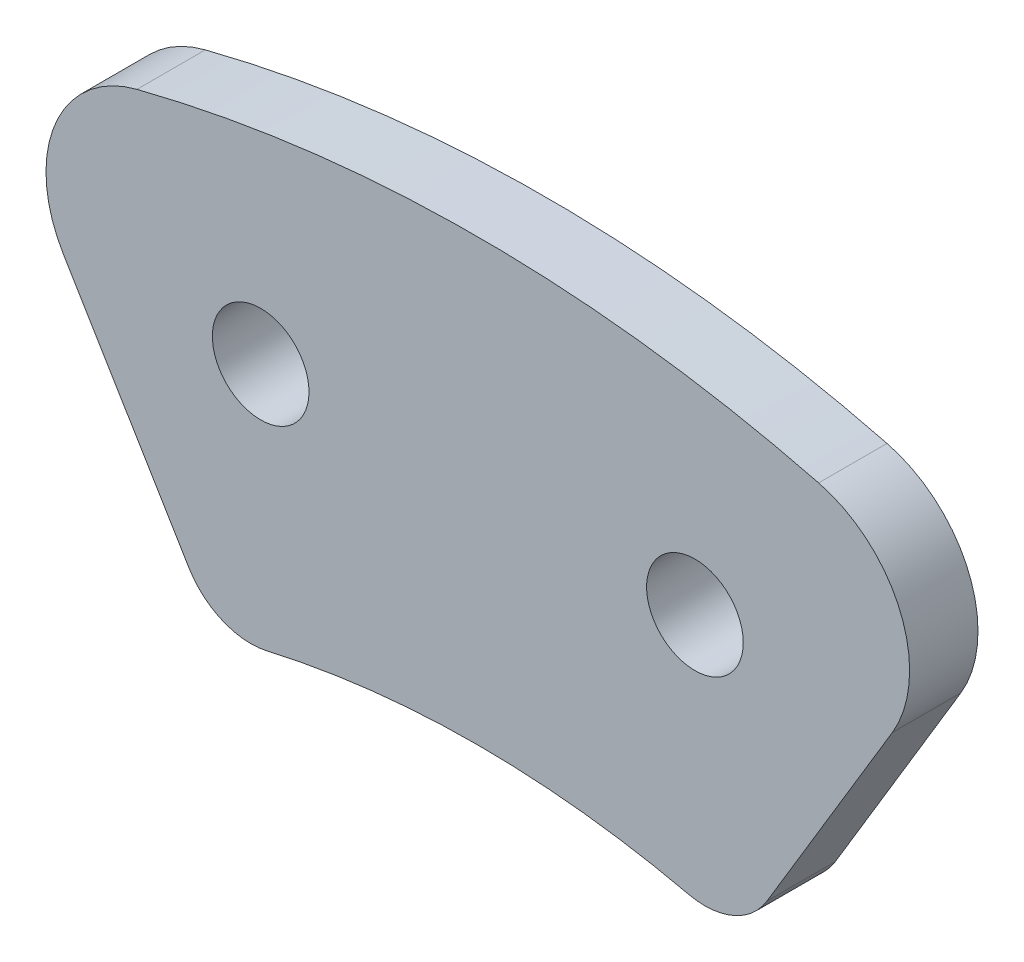
ISO-10303-21;
HEADER;
FILE_DESCRIPTION(('STEP AP214'),'2;1');
FILE_NAME('part.step','',(''),(''),'','','');
FILE_SCHEMA(('AUTOMOTIVE_DESIGN { 1 0 10303 214 1 1 1 1 }'));
ENDSEC;
DATA;
#1=APPLICATION_CONTEXT('core data for automotive mechanical design processes');
#2=APPLICATION_PROTOCOL_DEFINITION('international standard','automotive_design',2000,#1);
#3=PRODUCT_CONTEXT('',#1,'mechanical');
#4=PRODUCT('Part','Part','',(#3));
#5=PRODUCT_RELATED_PRODUCT_CATEGORY('part','',(#4));
#6=PRODUCT_DEFINITION_FORMATION('','',#4);
#7=PRODUCT_DEFINITION_CONTEXT('part definition',#1,'design');
#8=PRODUCT_DEFINITION('design','',#6,#7);
#9=PRODUCT_DEFINITION_SHAPE('','',#8);
#10=(LENGTH_UNIT() NAMED_UNIT(*) SI_UNIT(.MILLI.,.METRE.));
#11=(NAMED_UNIT(*) PLANE_ANGLE_UNIT() SI_UNIT($,.RADIAN.));
#12=(NAMED_UNIT(*) SI_UNIT($,.STERADIAN.) SOLID_ANGLE_UNIT());
#13=UNCERTAINTY_MEASURE_WITH_UNIT(LENGTH_MEASURE(1.E-05),#10,'distance_accuracy_value','');
#14=(GEOMETRIC_REPRESENTATION_CONTEXT(3) GLOBAL_UNCERTAINTY_ASSIGNED_CONTEXT((#13)) GLOBAL_UNIT_ASSIGNED_CONTEXT((#10,
#11,#12)) REPRESENTATION_CONTEXT('',''));
#15=CARTESIAN_POINT('',(0.,0.,0.));
#16=DIRECTION('',(0.,0.,1.));
#17=DIRECTION('',(1.,0.,0.));
#18=AXIS2_PLACEMENT_3D('',#15,#16,#17);
#19=CARTESIAN_POINT('',(0.,0.,0.75));
#20=DIRECTION('',(0.,0.,1.));
#21=DIRECTION('',(1.,0.,0.));
#22=AXIS2_PLACEMENT_3D('',#19,#20,#21);
#23=PLANE('',#22);
#24=CARTESIAN_POINT('',(-4.76250000000001,25.4771247449903,0.75));
#25=DIRECTION('',(0.,0.,1.));
#26=DIRECTION('',(1.,0.,0.));
#27=AXIS2_PLACEMENT_3D('',#24,#25,#26);
#28=CIRCLE('',#27,1.06);
#29=CARTESIAN_POINT('',(-3.70250000000001,25.4771247449903,0.75));
#30=VERTEX_POINT('',#29);
#31=EDGE_CURVE('E176',#30,#30,#28,.T.);
#32=ORIENTED_EDGE('',*,*,#31,.F.);
#33=EDGE_LOOP('',(#32));
#34=FACE_BOUND('',#33,.T.);
#35=DIRECTION('',(0.515038074910055,-0.857167300702112,0.));
#36=VECTOR('',#35,1.);
#37=CARTESIAN_POINT('',(-5.73072103720139,19.8109311438067,0.75));
#38=LINE('',#37,#36);
#39=CARTESIAN_POINT('',(-9.09308728234167,25.4068482977416,0.75));
#40=VERTEX_POINT('',#39);
#41=CARTESIAN_POINT('',(-6.34238958738464,20.8289185618757,0.75));
#42=VERTEX_POINT('',#41);
#43=EDGE_CURVE('E135',#40,#42,#38,.T.);
#44=ORIENTED_EDGE('',*,*,#43,.T.);
#45=CARTESIAN_POINT('',(-4.97949357926829,21.6478291009827,0.75));
#46=DIRECTION('',(0.,0.,1.));
#47=DIRECTION('',(1.,0.,0.));
#48=AXIS2_PLACEMENT_3D('',#45,#46,#47);
#49=CIRCLE('',#48,1.59);
#50=CARTESIAN_POINT('',(-4.62306523976564,20.0982940614307,0.75));
#51=VERTEX_POINT('',#50);
#52=EDGE_CURVE('E39',#42,#51,#49,.T.);
#53=ORIENTED_EDGE('',*,*,#52,.T.);
#54=CARTESIAN_POINT('',(0.,0.,0.75));
#55=DIRECTION('',(0.,0.,-1.));
#56=DIRECTION('',(1.,0.,0.));
#57=AXIS2_PLACEMENT_3D('',#54,#55,#56);
#58=CIRCLE('',#57,20.6231461322193);
#59=CARTESIAN_POINT('',(4.62306523976564,20.0982940614307,0.75));
#60=VERTEX_POINT('',#59);
#61=EDGE_CURVE('E129',#51,#60,#58,.T.);
#62=ORIENTED_EDGE('',*,*,#61,.T.);
#63=CARTESIAN_POINT('',(4.97949357926829,21.6478291009827,0.75));
#64=DIRECTION('',(0.,0.,1.));
#65=DIRECTION('',(1.,0.,0.));
#66=AXIS2_PLACEMENT_3D('',#63,#64,#65);
#67=CIRCLE('',#66,1.59);
#68=CARTESIAN_POINT('',(6.34238958738464,20.8289185618757,0.75));
#69=VERTEX_POINT('',#68);
#70=EDGE_CURVE('E46',#60,#69,#67,.T.);
#71=ORIENTED_EDGE('',*,*,#70,.T.);
#72=DIRECTION('',(0.515038074910056,0.857167300702111,0.));
#73=VECTOR('',#72,1.);
#74=CARTESIAN_POINT('',(5.73072103720139,19.8109311438067,0.75));
#75=LINE('',#74,#73);
#76=CARTESIAN_POINT('',(9.09308728234167,25.4068482977416,0.75));
#77=VERTEX_POINT('',#76);
#78=EDGE_CURVE('E165',#69,#77,#75,.T.);
#79=ORIENTED_EDGE('',*,*,#78,.T.);
#80=CARTESIAN_POINT('',(6.82159393548107,26.7716991962532,0.75));
#81=DIRECTION('',(0.,0.,1.));
#82=DIRECTION('',(1.,0.,0.));
#83=AXIS2_PLACEMENT_3D('',#80,#81,#82);
#84=CIRCLE('',#83,2.65);
#85=CARTESIAN_POINT('',(7.47592275528715,29.3396465858177,0.75));
#86=VERTEX_POINT('',#85);
#87=EDGE_CURVE('E141',#77,#86,#84,.T.);
#88=ORIENTED_EDGE('',*,*,#87,.T.);
#89=CARTESIAN_POINT('',(0.,0.,0.75));
#90=DIRECTION('',(0.,0.,1.));
#91=DIRECTION('',(1.,0.,0.));
#92=AXIS2_PLACEMENT_3D('',#89,#90,#91);
#93=CIRCLE('',#92,30.2771247449903);
#94=CARTESIAN_POINT('',(-7.47592275528715,29.3396465858177,0.75));
#95=VERTEX_POINT('',#94);
#96=EDGE_CURVE('E119',#86,#95,#93,.T.);
#97=ORIENTED_EDGE('',*,*,#96,.T.);
#98=CARTESIAN_POINT('',(-6.82159393548107,26.7716991962532,0.75));
#99=DIRECTION('',(0.,0.,1.));
#100=DIRECTION('',(1.,0.,0.));
#101=AXIS2_PLACEMENT_3D('',#98,#99,#100);
#102=CIRCLE('',#101,2.65);
#103=EDGE_CURVE('E139',#95,#40,#102,.T.);
#104=ORIENTED_EDGE('',*,*,#103,.T.);
#105=EDGE_LOOP('',(#44,#53,#62,#71,#79,#88,#97,#104));
#106=FACE_BOUND('',#105,.T.);
#107=CARTESIAN_POINT('',(4.76250000000001,25.4771247449903,0.75));
#108=DIRECTION('',(0.,0.,1.));
#109=DIRECTION('',(1.,0.,0.));
#110=AXIS2_PLACEMENT_3D('',#107,#108,#109);
#111=CIRCLE('',#110,1.06);
#112=CARTESIAN_POINT('',(5.82250000000001,25.4771247449903,0.75));
#113=VERTEX_POINT('',#112);
#114=EDGE_CURVE('E183',#113,#113,#111,.T.);
#115=ORIENTED_EDGE('',*,*,#114,.F.);
#116=EDGE_LOOP('',(#115));
#117=FACE_BOUND('',#116,.T.);
#118=ADVANCED_FACE('F31',(#34,#106,#117),#23,.T.);
#119=CARTESIAN_POINT('',(0.,0.,-0.75));
#120=DIRECTION('',(0.,0.,1.));
#121=DIRECTION('',(1.,0.,0.));
#122=AXIS2_PLACEMENT_3D('',#119,#120,#121);
#123=PLANE('',#122);
#124=CARTESIAN_POINT('',(-4.76250000000001,25.4771247449903,-0.75));
#125=DIRECTION('',(0.,0.,1.));
#126=DIRECTION('',(1.,0.,0.));
#127=AXIS2_PLACEMENT_3D('',#124,#125,#126);
#128=CIRCLE('',#127,1.06);
#129=CARTESIAN_POINT('',(-3.70250000000001,25.4771247449903,-0.75));
#130=VERTEX_POINT('',#129);
#131=EDGE_CURVE('E178',#130,#130,#128,.T.);
#132=ORIENTED_EDGE('',*,*,#131,.T.);
#133=EDGE_LOOP('',(#132));
#134=FACE_BOUND('',#133,.T.);
#135=CARTESIAN_POINT('',(0.,0.,-0.75));
#136=DIRECTION('',(0.,0.,-1.));
#137=DIRECTION('',(1.,0.,0.));
#138=AXIS2_PLACEMENT_3D('',#135,#136,#137);
#139=CIRCLE('',#138,20.6231461322193);
#140=CARTESIAN_POINT('',(-4.62306523976564,20.0982940614307,-0.75));
#141=VERTEX_POINT('',#140);
#142=CARTESIAN_POINT('',(4.62306523976564,20.0982940614307,-0.75));
#143=VERTEX_POINT('',#142);
#144=EDGE_CURVE('E131',#141,#143,#139,.T.);
#145=ORIENTED_EDGE('',*,*,#144,.F.);
#146=CARTESIAN_POINT('',(-4.97949357926829,21.6478291009827,-0.75));
#147=DIRECTION('',(0.,0.,1.));
#148=DIRECTION('',(1.,0.,0.));
#149=AXIS2_PLACEMENT_3D('',#146,#147,#148);
#150=CIRCLE('',#149,1.59);
#151=CARTESIAN_POINT('',(-6.34238958738464,20.8289185618757,-0.75));
#152=VERTEX_POINT('',#151);
#153=EDGE_CURVE('E153',#141,#152,#150,.F.);
#154=ORIENTED_EDGE('',*,*,#153,.T.);
#155=DIRECTION('',(0.515038074910055,-0.857167300702112,0.));
#156=VECTOR('',#155,1.);
#157=CARTESIAN_POINT('',(-5.73072103720139,19.8109311438067,-0.75));
#158=LINE('',#157,#156);
#159=CARTESIAN_POINT('',(-9.09308728234167,25.4068482977416,-0.75));
#160=VERTEX_POINT('',#159);
#161=EDGE_CURVE('E126',#160,#152,#158,.T.);
#162=ORIENTED_EDGE('',*,*,#161,.F.);
#163=CARTESIAN_POINT('',(-6.82159393548107,26.7716991962532,-0.75));
#164=DIRECTION('',(0.,0.,1.));
#165=DIRECTION('',(1.,0.,0.));
#166=AXIS2_PLACEMENT_3D('',#163,#164,#165);
#167=CIRCLE('',#166,2.65);
#168=CARTESIAN_POINT('',(-7.47592275528715,29.3396465858177,-0.75));
#169=VERTEX_POINT('',#168);
#170=EDGE_CURVE('E110',#160,#169,#167,.F.);
#171=ORIENTED_EDGE('',*,*,#170,.T.);
#172=CARTESIAN_POINT('',(0.,0.,-0.75));
#173=DIRECTION('',(0.,0.,1.));
#174=DIRECTION('',(1.,0.,0.));
#175=AXIS2_PLACEMENT_3D('',#172,#173,#174);
#176=CIRCLE('',#175,30.2771247449903);
#177=CARTESIAN_POINT('',(7.47592275528715,29.3396465858177,-0.75));
#178=VERTEX_POINT('',#177);
#179=EDGE_CURVE('E116',#178,#169,#176,.T.);
#180=ORIENTED_EDGE('',*,*,#179,.F.);
#181=CARTESIAN_POINT('',(6.82159393548107,26.7716991962532,-0.75));
#182=DIRECTION('',(0.,0.,1.));
#183=DIRECTION('',(1.,0.,0.));
#184=AXIS2_PLACEMENT_3D('',#181,#182,#183);
#185=CIRCLE('',#184,2.65);
#186=CARTESIAN_POINT('',(9.09308728234167,25.4068482977416,-0.75));
#187=VERTEX_POINT('',#186);
#188=EDGE_CURVE('E100',#178,#187,#185,.F.);
#189=ORIENTED_EDGE('',*,*,#188,.T.);
#190=DIRECTION('',(0.515038074910055,0.857167300702112,0.));
#191=VECTOR('',#190,1.);
#192=CARTESIAN_POINT('',(8.3001417413429,24.087165303236,-0.75));
#193=LINE('',#192,#191);
#194=CARTESIAN_POINT('',(6.34238958738465,20.8289185618757,-0.75));
#195=VERTEX_POINT('',#194);
#196=EDGE_CURVE('E127',#195,#187,#193,.T.);
#197=ORIENTED_EDGE('',*,*,#196,.F.);
#198=CARTESIAN_POINT('',(4.97949357926829,21.6478291009827,-0.75));
#199=DIRECTION('',(0.,0.,1.));
#200=DIRECTION('',(1.,0.,0.));
#201=AXIS2_PLACEMENT_3D('',#198,#199,#200);
#202=CIRCLE('',#201,1.59);
#203=EDGE_CURVE('E151',#195,#143,#202,.F.);
#204=ORIENTED_EDGE('',*,*,#203,.T.);
#205=EDGE_LOOP('',(#145,#154,#162,#171,#180,#189,#197,#204));
#206=FACE_BOUND('',#205,.T.);
#207=CARTESIAN_POINT('',(4.76250000000001,25.4771247449903,-0.75));
#208=DIRECTION('',(0.,0.,1.));
#209=DIRECTION('',(1.,0.,0.));
#210=AXIS2_PLACEMENT_3D('',#207,#208,#209);
#211=CIRCLE('',#210,1.06);
#212=CARTESIAN_POINT('',(5.82250000000001,25.4771247449903,-0.75));
#213=VERTEX_POINT('',#212);
#214=EDGE_CURVE('E186',#213,#213,#211,.T.);
#215=ORIENTED_EDGE('',*,*,#214,.T.);
#216=EDGE_LOOP('',(#215));
#217=FACE_BOUND('',#216,.T.);
#218=ADVANCED_FACE('F123',(#134,#206,#217),#123,.F.);
#219=CARTESIAN_POINT('',(0.,0.,0.75));
#220=DIRECTION('',(0.,0.,-1.));
#221=DIRECTION('',(-1.,0.,0.));
#222=AXIS2_PLACEMENT_3D('',#219,#220,#221);
#223=CYLINDRICAL_SURFACE('',#222,20.6231461322193);
#224=ORIENTED_EDGE('',*,*,#61,.F.);
#225=DIRECTION('',(0.,0.,-1.));
#226=VECTOR('',#225,1.);
#227=CARTESIAN_POINT('',(-4.62306523976564,20.0982940614307,0.75));
#228=LINE('',#227,#226);
#229=EDGE_CURVE('E148',#51,#141,#228,.T.);
#230=ORIENTED_EDGE('',*,*,#229,.T.);
#231=ORIENTED_EDGE('',*,*,#144,.T.);
#232=DIRECTION('',(0.,0.,-1.));
#233=VECTOR('',#232,1.);
#234=CARTESIAN_POINT('',(4.62306523976564,20.0982940614307,0.75));
#235=LINE('',#234,#233);
#236=EDGE_CURVE('E146',#143,#60,#235,.F.);
#237=ORIENTED_EDGE('',*,*,#236,.T.);
#238=EDGE_LOOP('',(#224,#230,#231,#237));
#239=FACE_BOUND('',#238,.T.);
#240=ADVANCED_FACE('F162',(#239),#223,.F.);
#241=CARTESIAN_POINT('',(8.3001417413429,24.087165303236,0.75));
#242=DIRECTION('',(-0.857167300702112,0.515038074910055,0.));
#243=DIRECTION('',(-0.515038074910055,-0.857167300702112,0.));
#244=AXIS2_PLACEMENT_3D('',#241,#242,#243);
#245=PLANE('',#244);
#246=ORIENTED_EDGE('',*,*,#78,.F.);
#247=DIRECTION('',(0.,0.,-1.));
#248=VECTOR('',#247,1.);
#249=CARTESIAN_POINT('',(6.34238958738465,20.8289185618757,0.75));
#250=LINE('',#249,#248);
#251=EDGE_CURVE('E11',#69,#195,#250,.T.);
#252=ORIENTED_EDGE('',*,*,#251,.T.);
#253=ORIENTED_EDGE('',*,*,#196,.T.);
#254=DIRECTION('',(0.,0.,-1.));
#255=VECTOR('',#254,1.);
#256=CARTESIAN_POINT('',(9.09308728234167,25.4068482977416,0.75));
#257=LINE('',#256,#255);
#258=EDGE_CURVE('E106',#187,#77,#257,.F.);
#259=ORIENTED_EDGE('',*,*,#258,.T.);
#260=EDGE_LOOP('',(#246,#252,#253,#259));
#261=FACE_BOUND('',#260,.T.);
#262=ADVANCED_FACE('F210',(#261),#245,.F.);
#263=CARTESIAN_POINT('',(0.,0.,0.75));
#264=DIRECTION('',(0.,0.,-1.));
#265=DIRECTION('',(-1.,0.,0.));
#266=AXIS2_PLACEMENT_3D('',#263,#264,#265);
#267=CYLINDRICAL_SURFACE('',#266,30.2771247449903);
#268=ORIENTED_EDGE('',*,*,#96,.F.);
#269=DIRECTION('',(0.,0.,-1.));
#270=VECTOR('',#269,1.);
#271=CARTESIAN_POINT('',(7.47592275528715,29.3396465858177,0.75));
#272=LINE('',#271,#270);
#273=EDGE_CURVE('E104',#86,#178,#272,.T.);
#274=ORIENTED_EDGE('',*,*,#273,.T.);
#275=ORIENTED_EDGE('',*,*,#179,.T.);
#276=DIRECTION('',(0.,0.,-1.));
#277=VECTOR('',#276,1.);
#278=CARTESIAN_POINT('',(-7.47592275528715,29.3396465858177,0.75));
#279=LINE('',#278,#277);
#280=EDGE_CURVE('E120',#169,#95,#279,.F.);
#281=ORIENTED_EDGE('',*,*,#280,.T.);
#282=EDGE_LOOP('',(#268,#274,#275,#281));
#283=FACE_BOUND('',#282,.T.);
#284=ADVANCED_FACE('F115',(#283),#267,.T.);
#285=CARTESIAN_POINT('',(-5.73072103720139,19.8109311438067,0.75));
#286=DIRECTION('',(0.857167300702111,0.515038074910055,0.));
#287=DIRECTION('',(-0.515038074910055,0.857167300702112,0.));
#288=AXIS2_PLACEMENT_3D('',#285,#286,#287);
#289=PLANE('',#288);
#290=ORIENTED_EDGE('',*,*,#161,.T.);
#291=DIRECTION('',(0.,0.,-1.));
#292=VECTOR('',#291,1.);
#293=CARTESIAN_POINT('',(-6.34238958738464,20.8289185618757,0.75));
#294=LINE('',#293,#292);
#295=EDGE_CURVE('E54',#152,#42,#294,.F.);
#296=ORIENTED_EDGE('',*,*,#295,.T.);
#297=ORIENTED_EDGE('',*,*,#43,.F.);
#298=DIRECTION('',(0.,0.,-1.));
#299=VECTOR('',#298,1.);
#300=CARTESIAN_POINT('',(-9.09308728234167,25.4068482977416,0.75));
#301=LINE('',#300,#299);
#302=EDGE_CURVE('E143',#40,#160,#301,.T.);
#303=ORIENTED_EDGE('',*,*,#302,.T.);
#304=EDGE_LOOP('',(#290,#296,#297,#303));
#305=FACE_BOUND('',#304,.T.);
#306=ADVANCED_FACE('F168',(#305),#289,.F.);
#307=CARTESIAN_POINT('',(-4.76250000000001,25.4771247449903,0.75));
#308=DIRECTION('',(0.,0.,-1.));
#309=DIRECTION('',(-1.,0.,0.));
#310=AXIS2_PLACEMENT_3D('',#307,#308,#309);
#311=CYLINDRICAL_SURFACE('',#310,1.06);
#312=ORIENTED_EDGE('',*,*,#31,.T.);
#313=EDGE_LOOP('',(#312));
#314=FACE_BOUND('',#313,.T.);
#315=ORIENTED_EDGE('',*,*,#131,.F.);
#316=EDGE_LOOP('',(#315));
#317=FACE_BOUND('',#316,.T.);
#318=ADVANCED_FACE('F203',(#314,#317),#311,.F.);
#319=CARTESIAN_POINT('',(4.76250000000001,25.4771247449903,0.75));
#320=DIRECTION('',(0.,0.,-1.));
#321=DIRECTION('',(-1.,0.,0.));
#322=AXIS2_PLACEMENT_3D('',#319,#320,#321);
#323=CYLINDRICAL_SURFACE('',#322,1.06);
#324=ORIENTED_EDGE('',*,*,#114,.T.);
#325=EDGE_LOOP('',(#324));
#326=FACE_BOUND('',#325,.T.);
#327=ORIENTED_EDGE('',*,*,#214,.F.);
#328=EDGE_LOOP('',(#327));
#329=FACE_BOUND('',#328,.T.);
#330=ADVANCED_FACE('F192',(#326,#329),#323,.F.);
#331=CARTESIAN_POINT('',(6.82159393548107,26.7716991962532,0.75));
#332=DIRECTION('',(0.,0.,-1.));
#333=DIRECTION('',(-1.,0.,0.));
#334=AXIS2_PLACEMENT_3D('',#331,#332,#333);
#335=CYLINDRICAL_SURFACE('',#334,2.65);
#336=ORIENTED_EDGE('',*,*,#87,.F.);
#337=ORIENTED_EDGE('',*,*,#258,.F.);
#338=ORIENTED_EDGE('',*,*,#188,.F.);
#339=ORIENTED_EDGE('',*,*,#273,.F.);
#340=EDGE_LOOP('',(#336,#337,#338,#339));
#341=FACE_BOUND('',#340,.T.);
#342=ADVANCED_FACE('F103',(#341),#335,.T.);
#343=CARTESIAN_POINT('',(-6.82159393548107,26.7716991962532,0.75));
#344=DIRECTION('',(0.,0.,-1.));
#345=DIRECTION('',(-1.,0.,0.));
#346=AXIS2_PLACEMENT_3D('',#343,#344,#345);
#347=CYLINDRICAL_SURFACE('',#346,2.65);
#348=ORIENTED_EDGE('',*,*,#103,.F.);
#349=ORIENTED_EDGE('',*,*,#280,.F.);
#350=ORIENTED_EDGE('',*,*,#170,.F.);
#351=ORIENTED_EDGE('',*,*,#302,.F.);
#352=EDGE_LOOP('',(#348,#349,#350,#351));
#353=FACE_BOUND('',#352,.T.);
#354=ADVANCED_FACE('F172',(#353),#347,.T.);
#355=CARTESIAN_POINT('',(-4.97949357926829,21.6478291009827,0.75));
#356=DIRECTION('',(0.,0.,-1.));
#357=DIRECTION('',(-1.,0.,0.));
#358=AXIS2_PLACEMENT_3D('',#355,#356,#357);
#359=CYLINDRICAL_SURFACE('',#358,1.59);
#360=ORIENTED_EDGE('',*,*,#52,.F.);
#361=ORIENTED_EDGE('',*,*,#295,.F.);
#362=ORIENTED_EDGE('',*,*,#153,.F.);
#363=ORIENTED_EDGE('',*,*,#229,.F.);
#364=EDGE_LOOP('',(#360,#361,#362,#363));
#365=FACE_BOUND('',#364,.T.);
#366=ADVANCED_FACE('F167',(#365),#359,.T.);
#367=CARTESIAN_POINT('',(4.97949357926829,21.6478291009827,0.75));
#368=DIRECTION('',(0.,0.,-1.));
#369=DIRECTION('',(-1.,0.,0.));
#370=AXIS2_PLACEMENT_3D('',#367,#368,#369);
#371=CYLINDRICAL_SURFACE('',#370,1.59);
#372=ORIENTED_EDGE('',*,*,#70,.F.);
#373=ORIENTED_EDGE('',*,*,#236,.F.);
#374=ORIENTED_EDGE('',*,*,#203,.F.);
#375=ORIENTED_EDGE('',*,*,#251,.F.);
#376=EDGE_LOOP('',(#372,#373,#374,#375));
#377=FACE_BOUND('',#376,.T.);
#378=ADVANCED_FACE('F33',(#377),#371,.T.);
#379=CLOSED_SHELL('',(#118,#218,#240,#262,#284,#306,#318,#330,#342,#354,#366,#378));
#380=MANIFOLD_SOLID_BREP('B2',#379);
#381=ADVANCED_BREP_SHAPE_REPRESENTATION('',(#18,#380),#14);
#382=SHAPE_DEFINITION_REPRESENTATION(#9,#381);
ENDSEC;
END-ISO-10303-21;
